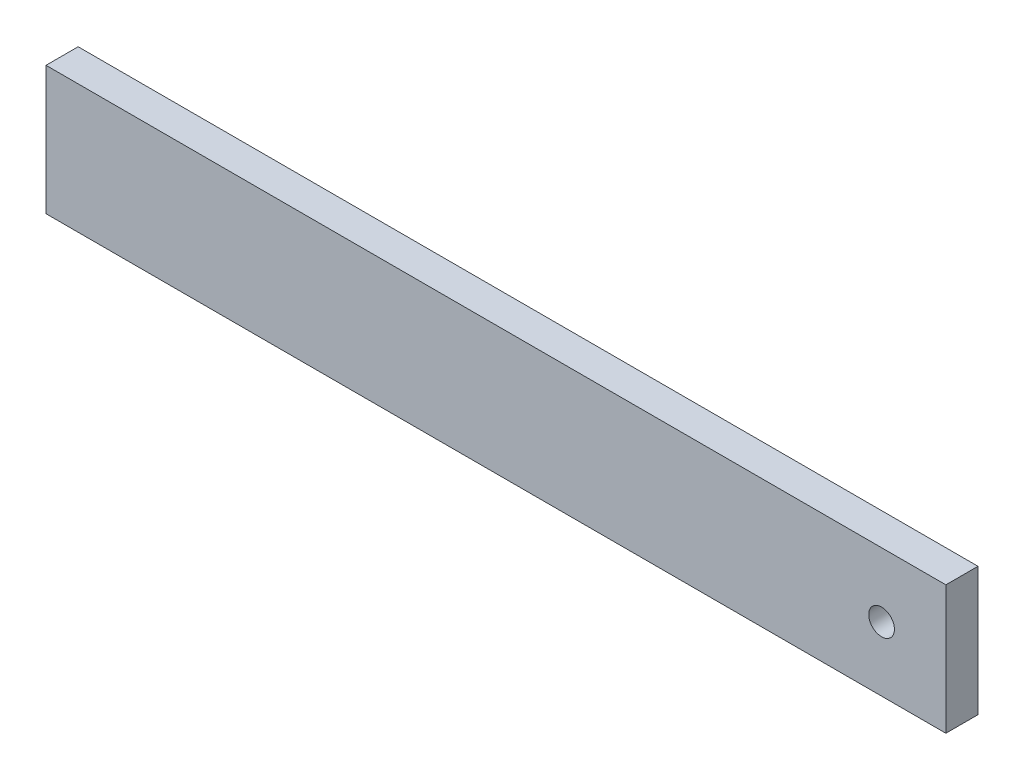
ISO-10303-21;
HEADER;
FILE_DESCRIPTION(('STEP AP214'),'2;1');
FILE_NAME('part.step','',(''),(''),'','','');
FILE_SCHEMA(('AUTOMOTIVE_DESIGN { 1 0 10303 214 1 1 1 1 }'));
ENDSEC;
DATA;
#1=APPLICATION_CONTEXT('core data for automotive mechanical design processes');
#2=APPLICATION_PROTOCOL_DEFINITION('international standard','automotive_design',2000,#1);
#3=PRODUCT_CONTEXT('',#1,'mechanical');
#4=PRODUCT('Part','Part','',(#3));
#5=PRODUCT_RELATED_PRODUCT_CATEGORY('part','',(#4));
#6=PRODUCT_DEFINITION_FORMATION('','',#4);
#7=PRODUCT_DEFINITION_CONTEXT('part definition',#1,'design');
#8=PRODUCT_DEFINITION('design','',#6,#7);
#9=PRODUCT_DEFINITION_SHAPE('','',#8);
#10=(LENGTH_UNIT() NAMED_UNIT(*) SI_UNIT(.MILLI.,.METRE.));
#11=(NAMED_UNIT(*) PLANE_ANGLE_UNIT() SI_UNIT($,.RADIAN.));
#12=(NAMED_UNIT(*) SI_UNIT($,.STERADIAN.) SOLID_ANGLE_UNIT());
#13=UNCERTAINTY_MEASURE_WITH_UNIT(LENGTH_MEASURE(1.E-05),#10,'distance_accuracy_value','');
#14=(GEOMETRIC_REPRESENTATION_CONTEXT(3) GLOBAL_UNCERTAINTY_ASSIGNED_CONTEXT((#13)) GLOBAL_UNIT_ASSIGNED_CONTEXT((#10,
#11,#12)) REPRESENTATION_CONTEXT('',''));
#15=CARTESIAN_POINT('',(0.,0.,0.));
#16=DIRECTION('',(0.,0.,1.));
#17=DIRECTION('',(1.,0.,0.));
#18=AXIS2_PLACEMENT_3D('',#15,#16,#17);
#19=CARTESIAN_POINT('',(0.,0.,5.));
#20=DIRECTION('',(0.,0.,1.));
#21=DIRECTION('',(1.,0.,0.));
#22=AXIS2_PLACEMENT_3D('',#19,#20,#21);
#23=PLANE('',#22);
#24=DIRECTION('',(0.,1.,0.));
#25=VECTOR('',#24,1.);
#26=CARTESIAN_POINT('',(0.,0.,5.));
#27=LINE('',#26,#25);
#28=CARTESIAN_POINT('',(0.,0.,5.));
#29=VERTEX_POINT('',#28);
#30=CARTESIAN_POINT('',(0.,20.,5.));
#31=VERTEX_POINT('',#30);
#32=EDGE_CURVE('E85',#29,#31,#27,.T.);
#33=ORIENTED_EDGE('',*,*,#32,.T.);
#34=DIRECTION('',(-1.,0.,0.));
#35=VECTOR('',#34,1.);
#36=CARTESIAN_POINT('',(0.,20.,5.));
#37=LINE('',#36,#35);
#38=CARTESIAN_POINT('',(-140.,20.,5.));
#39=VERTEX_POINT('',#38);
#40=EDGE_CURVE('E80',#31,#39,#37,.T.);
#41=ORIENTED_EDGE('',*,*,#40,.T.);
#42=DIRECTION('',(0.,-1.,0.));
#43=VECTOR('',#42,1.);
#44=CARTESIAN_POINT('',(-140.,0.,5.));
#45=LINE('',#44,#43);
#46=CARTESIAN_POINT('',(-140.,0.,5.));
#47=VERTEX_POINT('',#46);
#48=EDGE_CURVE('E83',#39,#47,#45,.T.);
#49=ORIENTED_EDGE('',*,*,#48,.T.);
#50=DIRECTION('',(1.,0.,0.));
#51=VECTOR('',#50,1.);
#52=CARTESIAN_POINT('',(0.,0.,5.));
#53=LINE('',#52,#51);
#54=EDGE_CURVE('E50',#47,#29,#53,.T.);
#55=ORIENTED_EDGE('',*,*,#54,.T.);
#56=EDGE_LOOP('',(#33,#41,#49,#55));
#57=FACE_BOUND('',#56,.T.);
#58=CARTESIAN_POINT('',(-10.,10.,5.));
#59=DIRECTION('',(0.,0.,1.));
#60=DIRECTION('',(1.,0.,0.));
#61=AXIS2_PLACEMENT_3D('',#58,#59,#60);
#62=CIRCLE('',#61,2.);
#63=CARTESIAN_POINT('',(-8.,10.,5.));
#64=VERTEX_POINT('',#63);
#65=EDGE_CURVE('E100',#64,#64,#62,.T.);
#66=ORIENTED_EDGE('',*,*,#65,.F.);
#67=EDGE_LOOP('',(#66));
#68=FACE_BOUND('',#67,.T.);
#69=ADVANCED_FACE('F33',(#57,#68),#23,.T.);
#70=CARTESIAN_POINT('',(0.,0.,0.));
#71=DIRECTION('',(0.,0.,1.));
#72=DIRECTION('',(1.,0.,0.));
#73=AXIS2_PLACEMENT_3D('',#70,#71,#72);
#74=PLANE('',#73);
#75=DIRECTION('',(0.,1.,0.));
#76=VECTOR('',#75,1.);
#77=CARTESIAN_POINT('',(0.,0.,0.));
#78=LINE('',#77,#76);
#79=CARTESIAN_POINT('',(0.,0.,0.));
#80=VERTEX_POINT('',#79);
#81=CARTESIAN_POINT('',(0.,20.,0.));
#82=VERTEX_POINT('',#81);
#83=EDGE_CURVE('E97',#80,#82,#78,.T.);
#84=ORIENTED_EDGE('',*,*,#83,.F.);
#85=DIRECTION('',(1.,0.,0.));
#86=VECTOR('',#85,1.);
#87=CARTESIAN_POINT('',(0.,0.,0.));
#88=LINE('',#87,#86);
#89=CARTESIAN_POINT('',(-140.,0.,0.));
#90=VERTEX_POINT('',#89);
#91=EDGE_CURVE('E73',#90,#80,#88,.T.);
#92=ORIENTED_EDGE('',*,*,#91,.F.);
#93=DIRECTION('',(0.,-1.,0.));
#94=VECTOR('',#93,1.);
#95=CARTESIAN_POINT('',(-140.,0.,0.));
#96=LINE('',#95,#94);
#97=CARTESIAN_POINT('',(-140.,20.,0.));
#98=VERTEX_POINT('',#97);
#99=EDGE_CURVE('E67',#98,#90,#96,.T.);
#100=ORIENTED_EDGE('',*,*,#99,.F.);
#101=DIRECTION('',(-1.,0.,0.));
#102=VECTOR('',#101,1.);
#103=CARTESIAN_POINT('',(0.,20.,0.));
#104=LINE('',#103,#102);
#105=EDGE_CURVE('E89',#82,#98,#104,.T.);
#106=ORIENTED_EDGE('',*,*,#105,.F.);
#107=EDGE_LOOP('',(#84,#92,#100,#106));
#108=FACE_BOUND('',#107,.T.);
#109=CARTESIAN_POINT('',(-10.,10.,0.));
#110=DIRECTION('',(0.,0.,1.));
#111=DIRECTION('',(1.,0.,0.));
#112=AXIS2_PLACEMENT_3D('',#109,#110,#111);
#113=CIRCLE('',#112,2.);
#114=CARTESIAN_POINT('',(-8.,10.,0.));
#115=VERTEX_POINT('',#114);
#116=EDGE_CURVE('E112',#115,#115,#113,.T.);
#117=ORIENTED_EDGE('',*,*,#116,.T.);
#118=EDGE_LOOP('',(#117));
#119=FACE_BOUND('',#118,.T.);
#120=ADVANCED_FACE('F108',(#108,#119),#74,.F.);
#121=CARTESIAN_POINT('',(0.,0.,5.));
#122=DIRECTION('',(-1.,0.,0.));
#123=DIRECTION('',(0.,0.,1.));
#124=AXIS2_PLACEMENT_3D('',#121,#122,#123);
#125=PLANE('',#124);
#126=ORIENTED_EDGE('',*,*,#83,.T.);
#127=DIRECTION('',(0.,0.,-1.));
#128=VECTOR('',#127,1.);
#129=CARTESIAN_POINT('',(0.,20.,5.));
#130=LINE('',#129,#128);
#131=EDGE_CURVE('E11',#31,#82,#130,.T.);
#132=ORIENTED_EDGE('',*,*,#131,.F.);
#133=ORIENTED_EDGE('',*,*,#32,.F.);
#134=DIRECTION('',(0.,0.,-1.));
#135=VECTOR('',#134,1.);
#136=CARTESIAN_POINT('',(0.,0.,5.));
#137=LINE('',#136,#135);
#138=EDGE_CURVE('E93',#29,#80,#137,.T.);
#139=ORIENTED_EDGE('',*,*,#138,.T.);
#140=EDGE_LOOP('',(#126,#132,#133,#139));
#141=FACE_BOUND('',#140,.T.);
#142=ADVANCED_FACE('F35',(#141),#125,.F.);
#143=CARTESIAN_POINT('',(0.,20.,5.));
#144=DIRECTION('',(0.,-1.,0.));
#145=DIRECTION('',(1.,0.,0.));
#146=AXIS2_PLACEMENT_3D('',#143,#144,#145);
#147=PLANE('',#146);
#148=ORIENTED_EDGE('',*,*,#105,.T.);
#149=DIRECTION('',(0.,0.,-1.));
#150=VECTOR('',#149,1.);
#151=CARTESIAN_POINT('',(-140.,20.,5.));
#152=LINE('',#151,#150);
#153=EDGE_CURVE('E42',#39,#98,#152,.T.);
#154=ORIENTED_EDGE('',*,*,#153,.F.);
#155=ORIENTED_EDGE('',*,*,#40,.F.);
#156=ORIENTED_EDGE('',*,*,#131,.T.);
#157=EDGE_LOOP('',(#148,#154,#155,#156));
#158=FACE_BOUND('',#157,.T.);
#159=ADVANCED_FACE('F88',(#158),#147,.F.);
#160=CARTESIAN_POINT('',(-140.,0.,5.));
#161=DIRECTION('',(1.,0.,0.));
#162=DIRECTION('',(0.,0.,-1.));
#163=AXIS2_PLACEMENT_3D('',#160,#161,#162);
#164=PLANE('',#163);
#165=ORIENTED_EDGE('',*,*,#99,.T.);
#166=DIRECTION('',(0.,0.,-1.));
#167=VECTOR('',#166,1.);
#168=CARTESIAN_POINT('',(-140.,0.,5.));
#169=LINE('',#168,#167);
#170=EDGE_CURVE('E90',#47,#90,#169,.T.);
#171=ORIENTED_EDGE('',*,*,#170,.F.);
#172=ORIENTED_EDGE('',*,*,#48,.F.);
#173=ORIENTED_EDGE('',*,*,#153,.T.);
#174=EDGE_LOOP('',(#165,#171,#172,#173));
#175=FACE_BOUND('',#174,.T.);
#176=ADVANCED_FACE('F91',(#175),#164,.F.);
#177=CARTESIAN_POINT('',(0.,0.,5.));
#178=DIRECTION('',(0.,1.,0.));
#179=DIRECTION('',(-1.,0.,0.));
#180=AXIS2_PLACEMENT_3D('',#177,#178,#179);
#181=PLANE('',#180);
#182=ORIENTED_EDGE('',*,*,#91,.T.);
#183=ORIENTED_EDGE('',*,*,#138,.F.);
#184=ORIENTED_EDGE('',*,*,#54,.F.);
#185=ORIENTED_EDGE('',*,*,#170,.T.);
#186=EDGE_LOOP('',(#182,#183,#184,#185));
#187=FACE_BOUND('',#186,.T.);
#188=ADVANCED_FACE('F105',(#187),#181,.F.);
#189=CARTESIAN_POINT('',(-10.,10.,5.));
#190=DIRECTION('',(0.,0.,-1.));
#191=DIRECTION('',(-1.,0.,0.));
#192=AXIS2_PLACEMENT_3D('',#189,#190,#191);
#193=CYLINDRICAL_SURFACE('',#192,2.);
#194=ORIENTED_EDGE('',*,*,#65,.T.);
#195=EDGE_LOOP('',(#194));
#196=FACE_BOUND('',#195,.T.);
#197=ORIENTED_EDGE('',*,*,#116,.F.);
#198=EDGE_LOOP('',(#197));
#199=FACE_BOUND('',#198,.T.);
#200=ADVANCED_FACE('F118',(#196,#199),#193,.F.);
#201=CLOSED_SHELL('',(#69,#120,#142,#159,#176,#188,#200));
#202=MANIFOLD_SOLID_BREP('B2',#201);
#203=ADVANCED_BREP_SHAPE_REPRESENTATION('',(#18,#202),#14);
#204=SHAPE_DEFINITION_REPRESENTATION(#9,#203);
ENDSEC;
END-ISO-10303-21;
